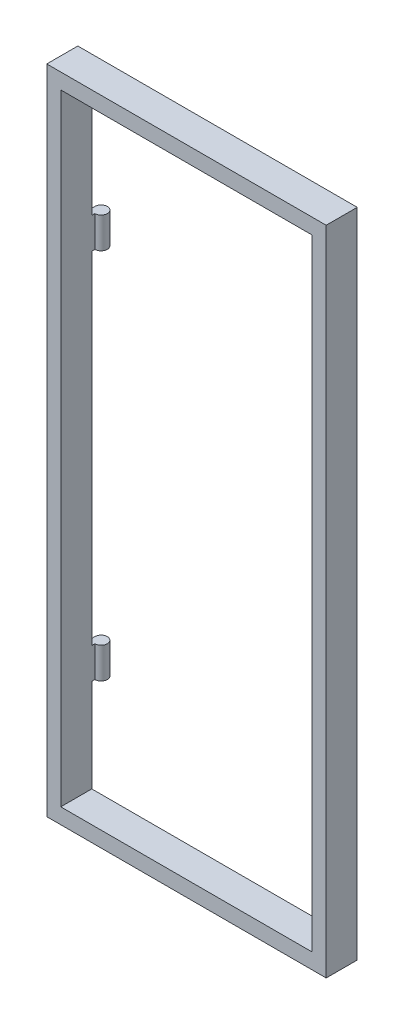
ISO-10303-21;
HEADER;
FILE_DESCRIPTION(('STEP AP214'),'2;1');
FILE_NAME('part.step','',(''),(''),'','','');
FILE_SCHEMA(('AUTOMOTIVE_DESIGN { 1 0 10303 214 1 1 1 1 }'));
ENDSEC;
DATA;
#1=APPLICATION_CONTEXT('core data for automotive mechanical design processes');
#2=APPLICATION_PROTOCOL_DEFINITION('international standard','automotive_design',2000,#1);
#3=PRODUCT_CONTEXT('',#1,'mechanical');
#4=PRODUCT('Part','Part','',(#3));
#5=PRODUCT_RELATED_PRODUCT_CATEGORY('part','',(#4));
#6=PRODUCT_DEFINITION_FORMATION('','',#4);
#7=PRODUCT_DEFINITION_CONTEXT('part definition',#1,'design');
#8=PRODUCT_DEFINITION('design','',#6,#7);
#9=PRODUCT_DEFINITION_SHAPE('','',#8);
#10=(LENGTH_UNIT() NAMED_UNIT(*) SI_UNIT(.MILLI.,.METRE.));
#11=(NAMED_UNIT(*) PLANE_ANGLE_UNIT() SI_UNIT($,.RADIAN.));
#12=(NAMED_UNIT(*) SI_UNIT($,.STERADIAN.) SOLID_ANGLE_UNIT());
#13=UNCERTAINTY_MEASURE_WITH_UNIT(LENGTH_MEASURE(1.E-05),#10,'distance_accuracy_value','');
#14=(GEOMETRIC_REPRESENTATION_CONTEXT(3) GLOBAL_UNCERTAINTY_ASSIGNED_CONTEXT((#13)) GLOBAL_UNIT_ASSIGNED_CONTEXT((#10,
#11,#12)) REPRESENTATION_CONTEXT('',''));
#15=CARTESIAN_POINT('',(0.,0.,0.));
#16=DIRECTION('',(0.,0.,1.));
#17=DIRECTION('',(1.,0.,0.));
#18=AXIS2_PLACEMENT_3D('',#15,#16,#17);
#19=CARTESIAN_POINT('',(-855.,2050.,-100.));
#20=DIRECTION('',(-1.,0.,0.));
#21=DIRECTION('',(0.,0.,-1.));
#22=AXIS2_PLACEMENT_3D('',#19,#20,#21);
#23=PLANE('',#22);
#24=DIRECTION('',(0.,1.,0.));
#25=VECTOR('',#24,1.);
#26=CARTESIAN_POINT('',(-855.,-706.568542494922,-110.000000000001));
#27=LINE('',#26,#25);
#28=CARTESIAN_POINT('',(-855.,350.000000000001,-110.000000000001));
#29=VERTEX_POINT('',#28);
#30=CARTESIAN_POINT('',(-855.,450.,-110.000000000001));
#31=VERTEX_POINT('',#30);
#32=EDGE_CURVE('E161',#29,#31,#27,.T.);
#33=ORIENTED_EDGE('',*,*,#32,.T.);
#34=DIRECTION('',(0.,0.,1.));
#35=VECTOR('',#34,1.);
#36=CARTESIAN_POINT('',(-855.,450.,-130.));
#37=LINE('',#36,#35);
#38=CARTESIAN_POINT('',(-855.,450.,-100.));
#39=VERTEX_POINT('',#38);
#40=EDGE_CURVE('E196',#31,#39,#37,.T.);
#41=ORIENTED_EDGE('',*,*,#40,.T.);
#42=DIRECTION('',(0.,1.,0.));
#43=VECTOR('',#42,1.);
#44=CARTESIAN_POINT('',(-855.,2050.,-100.));
#45=LINE('',#44,#43);
#46=CARTESIAN_POINT('',(-855.,1550.,-100.));
#47=VERTEX_POINT('',#46);
#48=EDGE_CURVE('E241',#39,#47,#45,.T.);
#49=ORIENTED_EDGE('',*,*,#48,.T.);
#50=DIRECTION('',(0.,0.,1.));
#51=VECTOR('',#50,1.);
#52=CARTESIAN_POINT('',(-855.,1550.,-130.));
#53=LINE('',#52,#51);
#54=CARTESIAN_POINT('',(-855.,1550.,-110.000000000001));
#55=VERTEX_POINT('',#54);
#56=EDGE_CURVE('E213',#55,#47,#53,.T.);
#57=ORIENTED_EDGE('',*,*,#56,.F.);
#58=DIRECTION('',(0.,1.,0.));
#59=VECTOR('',#58,1.);
#60=CARTESIAN_POINT('',(-855.,1493.43145750508,-110.000000000001));
#61=LINE('',#60,#59);
#62=CARTESIAN_POINT('',(-855.,1650.,-110.000000000001));
#63=VERTEX_POINT('',#62);
#64=EDGE_CURVE('E206',#55,#63,#61,.T.);
#65=ORIENTED_EDGE('',*,*,#64,.T.);
#66=DIRECTION('',(0.,0.,1.));
#67=VECTOR('',#66,1.);
#68=CARTESIAN_POINT('',(-855.,1650.,-130.));
#69=LINE('',#68,#67);
#70=CARTESIAN_POINT('',(-855.,1650.,-100.));
#71=VERTEX_POINT('',#70);
#72=EDGE_CURVE('E233',#63,#71,#69,.T.);
#73=ORIENTED_EDGE('',*,*,#72,.T.);
#74=CARTESIAN_POINT('',(-855.,2050.,-100.));
#75=VERTEX_POINT('',#74);
#76=EDGE_CURVE('E242',#71,#75,#45,.T.);
#77=ORIENTED_EDGE('',*,*,#76,.T.);
#78=DIRECTION('',(0.,0.,1.));
#79=VECTOR('',#78,1.);
#80=CARTESIAN_POINT('',(-855.,2050.,-100.));
#81=LINE('',#80,#79);
#82=CARTESIAN_POINT('',(-855.,2050.,0.));
#83=VERTEX_POINT('',#82);
#84=EDGE_CURVE('E253',#75,#83,#81,.T.);
#85=ORIENTED_EDGE('',*,*,#84,.T.);
#86=DIRECTION('',(0.,1.,0.));
#87=VECTOR('',#86,1.);
#88=CARTESIAN_POINT('',(-855.,2050.,0.));
#89=LINE('',#88,#87);
#90=CARTESIAN_POINT('',(-855.,49.9999999999998,0.));
#91=VERTEX_POINT('',#90);
#92=EDGE_CURVE('E237',#91,#83,#89,.T.);
#93=ORIENTED_EDGE('',*,*,#92,.F.);
#94=DIRECTION('',(0.,0.,1.));
#95=VECTOR('',#94,1.);
#96=CARTESIAN_POINT('',(-855.,49.9999999999998,-100.));
#97=LINE('',#96,#95);
#98=CARTESIAN_POINT('',(-855.,49.9999999999998,-100.));
#99=VERTEX_POINT('',#98);
#100=EDGE_CURVE('E268',#99,#91,#97,.T.);
#101=ORIENTED_EDGE('',*,*,#100,.F.);
#102=CARTESIAN_POINT('',(-855.,350.000000000001,-100.));
#103=VERTEX_POINT('',#102);
#104=EDGE_CURVE('E169',#99,#103,#45,.T.);
#105=ORIENTED_EDGE('',*,*,#104,.T.);
#106=DIRECTION('',(0.,0.,1.));
#107=VECTOR('',#106,1.);
#108=CARTESIAN_POINT('',(-855.,350.000000000001,-130.));
#109=LINE('',#108,#107);
#110=EDGE_CURVE('E156',#29,#103,#109,.T.);
#111=ORIENTED_EDGE('',*,*,#110,.F.);
#112=EDGE_LOOP('',(#33,#41,#49,#57,#65,#73,#77,#85,#93,#101,#105,#111));
#113=FACE_BOUND('',#112,.T.);
#114=ADVANCED_FACE('F36',(#113),#23,.F.);
#115=CARTESIAN_POINT('',(0.,0.,0.));
#116=DIRECTION('',(0.,0.,1.));
#117=DIRECTION('',(-1.,0.,0.));
#118=AXIS2_PLACEMENT_3D('',#115,#116,#117);
#119=PLANE('',#118);
#120=DIRECTION('',(0.,-1.,0.));
#121=VECTOR('',#120,1.);
#122=CARTESIAN_POINT('',(0.,2100.,0.));
#123=LINE('',#122,#121);
#124=CARTESIAN_POINT('',(0.,2100.,0.));
#125=VERTEX_POINT('',#124);
#126=CARTESIAN_POINT('',(0.,0.,0.));
#127=VERTEX_POINT('',#126);
#128=EDGE_CURVE('E272',#125,#127,#123,.T.);
#129=ORIENTED_EDGE('',*,*,#128,.F.);
#130=DIRECTION('',(1.,0.,0.));
#131=VECTOR('',#130,1.);
#132=CARTESIAN_POINT('',(0.,2100.,0.));
#133=LINE('',#132,#131);
#134=CARTESIAN_POINT('',(-900.,2100.,0.));
#135=VERTEX_POINT('',#134);
#136=EDGE_CURVE('E287',#135,#125,#133,.T.);
#137=ORIENTED_EDGE('',*,*,#136,.F.);
#138=DIRECTION('',(0.,1.,0.));
#139=VECTOR('',#138,1.);
#140=CARTESIAN_POINT('',(-900.,2100.,0.));
#141=LINE('',#140,#139);
#142=CARTESIAN_POINT('',(-900.,1.04083408558608E-13,0.));
#143=VERTEX_POINT('',#142);
#144=EDGE_CURVE('E303',#143,#135,#141,.T.);
#145=ORIENTED_EDGE('',*,*,#144,.F.);
#146=DIRECTION('',(-1.,0.,0.));
#147=VECTOR('',#146,1.);
#148=CARTESIAN_POINT('',(0.,0.,0.));
#149=LINE('',#148,#147);
#150=EDGE_CURVE('E299',#127,#143,#149,.T.);
#151=ORIENTED_EDGE('',*,*,#150,.F.);
#152=EDGE_LOOP('',(#129,#137,#145,#151));
#153=FACE_BOUND('',#152,.T.);
#154=DIRECTION('',(1.,0.,0.));
#155=VECTOR('',#154,1.);
#156=CARTESIAN_POINT('',(-855.,2050.,0.));
#157=LINE('',#156,#155);
#158=CARTESIAN_POINT('',(-44.9999999999999,2050.,0.));
#159=VERTEX_POINT('',#158);
#160=EDGE_CURVE('E257',#83,#159,#157,.T.);
#161=ORIENTED_EDGE('',*,*,#160,.T.);
#162=DIRECTION('',(0.,-1.,0.));
#163=VECTOR('',#162,1.);
#164=CARTESIAN_POINT('',(-44.9999999999999,2050.,0.));
#165=LINE('',#164,#163);
#166=CARTESIAN_POINT('',(-44.9999999999999,49.9999999999998,0.));
#167=VERTEX_POINT('',#166);
#168=EDGE_CURVE('E261',#159,#167,#165,.T.);
#169=ORIENTED_EDGE('',*,*,#168,.T.);
#170=DIRECTION('',(-1.,0.,0.));
#171=VECTOR('',#170,1.);
#172=CARTESIAN_POINT('',(-855.,49.9999999999998,0.));
#173=LINE('',#172,#171);
#174=EDGE_CURVE('E265',#167,#91,#173,.T.);
#175=ORIENTED_EDGE('',*,*,#174,.T.);
#176=ORIENTED_EDGE('',*,*,#92,.T.);
#177=EDGE_LOOP('',(#161,#169,#175,#176));
#178=FACE_BOUND('',#177,.T.);
#179=ADVANCED_FACE('F326',(#153,#178),#119,.T.);
#180=CARTESIAN_POINT('',(0.,2100.,-100.));
#181=DIRECTION('',(1.,0.,0.));
#182=DIRECTION('',(0.,-1.,0.));
#183=AXIS2_PLACEMENT_3D('',#180,#181,#182);
#184=PLANE('',#183);
#185=ORIENTED_EDGE('',*,*,#128,.T.);
#186=DIRECTION('',(0.,0.,1.));
#187=VECTOR('',#186,1.);
#188=CARTESIAN_POINT('',(0.,0.,-100.));
#189=LINE('',#188,#187);
#190=CARTESIAN_POINT('',(0.,0.,-100.));
#191=VERTEX_POINT('',#190);
#192=EDGE_CURVE('E40',#191,#127,#189,.T.);
#193=ORIENTED_EDGE('',*,*,#192,.F.);
#194=DIRECTION('',(0.,-1.,0.));
#195=VECTOR('',#194,1.);
#196=CARTESIAN_POINT('',(0.,2100.,-100.));
#197=LINE('',#196,#195);
#198=CARTESIAN_POINT('',(0.,2100.,-100.));
#199=VERTEX_POINT('',#198);
#200=EDGE_CURVE('E282',#199,#191,#197,.T.);
#201=ORIENTED_EDGE('',*,*,#200,.F.);
#202=DIRECTION('',(0.,0.,1.));
#203=VECTOR('',#202,1.);
#204=CARTESIAN_POINT('',(0.,2100.,-100.));
#205=LINE('',#204,#203);
#206=EDGE_CURVE('E11',#199,#125,#205,.T.);
#207=ORIENTED_EDGE('',*,*,#206,.T.);
#208=EDGE_LOOP('',(#185,#193,#201,#207));
#209=FACE_BOUND('',#208,.T.);
#210=ADVANCED_FACE('F38',(#209),#184,.T.);
#211=CARTESIAN_POINT('',(0.,2100.,-100.));
#212=DIRECTION('',(0.,1.,0.));
#213=DIRECTION('',(0.,0.,1.));
#214=AXIS2_PLACEMENT_3D('',#211,#212,#213);
#215=PLANE('',#214);
#216=ORIENTED_EDGE('',*,*,#136,.T.);
#217=ORIENTED_EDGE('',*,*,#206,.F.);
#218=DIRECTION('',(1.,0.,0.));
#219=VECTOR('',#218,1.);
#220=CARTESIAN_POINT('',(0.,2100.,-100.));
#221=LINE('',#220,#219);
#222=CARTESIAN_POINT('',(-900.,2100.,-100.));
#223=VERTEX_POINT('',#222);
#224=EDGE_CURVE('E293',#223,#199,#221,.T.);
#225=ORIENTED_EDGE('',*,*,#224,.F.);
#226=DIRECTION('',(0.,0.,1.));
#227=VECTOR('',#226,1.);
#228=CARTESIAN_POINT('',(-900.,2100.,-100.));
#229=LINE('',#228,#227);
#230=EDGE_CURVE('E46',#223,#135,#229,.T.);
#231=ORIENTED_EDGE('',*,*,#230,.T.);
#232=EDGE_LOOP('',(#216,#217,#225,#231));
#233=FACE_BOUND('',#232,.T.);
#234=ADVANCED_FACE('F332',(#233),#215,.T.);
#235=CARTESIAN_POINT('',(-900.,2100.,-100.));
#236=DIRECTION('',(-1.,0.,0.));
#237=DIRECTION('',(0.,0.,-1.));
#238=AXIS2_PLACEMENT_3D('',#235,#236,#237);
#239=PLANE('',#238);
#240=ORIENTED_EDGE('',*,*,#144,.T.);
#241=ORIENTED_EDGE('',*,*,#230,.F.);
#242=DIRECTION('',(0.,1.,0.));
#243=VECTOR('',#242,1.);
#244=CARTESIAN_POINT('',(-900.,2100.,-100.));
#245=LINE('',#244,#243);
#246=CARTESIAN_POINT('',(-900.,1.04083408558608E-13,-100.));
#247=VERTEX_POINT('',#246);
#248=EDGE_CURVE('E290',#247,#223,#245,.T.);
#249=ORIENTED_EDGE('',*,*,#248,.F.);
#250=DIRECTION('',(0.,0.,1.));
#251=VECTOR('',#250,1.);
#252=CARTESIAN_POINT('',(-900.,1.04083408558608E-13,-100.));
#253=LINE('',#252,#251);
#254=EDGE_CURVE('E311',#247,#143,#253,.T.);
#255=ORIENTED_EDGE('',*,*,#254,.T.);
#256=EDGE_LOOP('',(#240,#241,#249,#255));
#257=FACE_BOUND('',#256,.T.);
#258=ADVANCED_FACE('F334',(#257),#239,.T.);
#259=CARTESIAN_POINT('',(0.,0.,-100.));
#260=DIRECTION('',(0.,-1.,0.));
#261=DIRECTION('',(-1.,0.,0.));
#262=AXIS2_PLACEMENT_3D('',#259,#260,#261);
#263=PLANE('',#262);
#264=ORIENTED_EDGE('',*,*,#150,.T.);
#265=ORIENTED_EDGE('',*,*,#254,.F.);
#266=DIRECTION('',(-1.,0.,0.));
#267=VECTOR('',#266,1.);
#268=CARTESIAN_POINT('',(0.,0.,-100.));
#269=LINE('',#268,#267);
#270=EDGE_CURVE('E286',#191,#247,#269,.T.);
#271=ORIENTED_EDGE('',*,*,#270,.F.);
#272=ORIENTED_EDGE('',*,*,#192,.T.);
#273=EDGE_LOOP('',(#264,#265,#271,#272));
#274=FACE_BOUND('',#273,.T.);
#275=ADVANCED_FACE('F320',(#274),#263,.T.);
#276=CARTESIAN_POINT('',(0.,0.,-100.));
#277=DIRECTION('',(0.,0.,1.));
#278=DIRECTION('',(-1.,0.,0.));
#279=AXIS2_PLACEMENT_3D('',#276,#277,#278);
#280=PLANE('',#279);
#281=DIRECTION('',(0.,1.,0.));
#282=VECTOR('',#281,1.);
#283=CARTESIAN_POINT('',(-875.,450.,-100.));
#284=LINE('',#283,#282);
#285=CARTESIAN_POINT('',(-875.,350.000000000001,-100.));
#286=VERTEX_POINT('',#285);
#287=CARTESIAN_POINT('',(-875.,450.,-100.));
#288=VERTEX_POINT('',#287);
#289=EDGE_CURVE('E180',#286,#288,#284,.T.);
#290=ORIENTED_EDGE('',*,*,#289,.F.);
#291=DIRECTION('',(-1.,0.,0.));
#292=VECTOR('',#291,1.);
#293=CARTESIAN_POINT('',(-855.,350.000000000001,-100.));
#294=LINE('',#293,#292);
#295=EDGE_CURVE('E185',#103,#286,#294,.T.);
#296=ORIENTED_EDGE('',*,*,#295,.F.);
#297=ORIENTED_EDGE('',*,*,#104,.F.);
#298=DIRECTION('',(-1.,0.,0.));
#299=VECTOR('',#298,1.);
#300=CARTESIAN_POINT('',(-855.,49.9999999999998,-100.));
#301=LINE('',#300,#299);
#302=CARTESIAN_POINT('',(-44.9999999999999,49.9999999999998,-100.));
#303=VERTEX_POINT('',#302);
#304=EDGE_CURVE('E250',#303,#99,#301,.T.);
#305=ORIENTED_EDGE('',*,*,#304,.F.);
#306=DIRECTION('',(0.,-1.,0.));
#307=VECTOR('',#306,1.);
#308=CARTESIAN_POINT('',(-44.9999999999999,2050.,-100.));
#309=LINE('',#308,#307);
#310=CARTESIAN_POINT('',(-44.9999999999999,2050.,-100.));
#311=VERTEX_POINT('',#310);
#312=EDGE_CURVE('E246',#311,#303,#309,.T.);
#313=ORIENTED_EDGE('',*,*,#312,.F.);
#314=DIRECTION('',(1.,0.,0.));
#315=VECTOR('',#314,1.);
#316=CARTESIAN_POINT('',(-855.,2050.,-100.));
#317=LINE('',#316,#315);
#318=EDGE_CURVE('E240',#75,#311,#317,.T.);
#319=ORIENTED_EDGE('',*,*,#318,.F.);
#320=ORIENTED_EDGE('',*,*,#76,.F.);
#321=DIRECTION('',(1.,0.,0.));
#322=VECTOR('',#321,1.);
#323=CARTESIAN_POINT('',(-855.,1650.,-100.));
#324=LINE('',#323,#322);
#325=CARTESIAN_POINT('',(-875.,1650.,-100.));
#326=VERTEX_POINT('',#325);
#327=EDGE_CURVE('E62',#326,#71,#324,.T.);
#328=ORIENTED_EDGE('',*,*,#327,.F.);
#329=DIRECTION('',(0.,1.,0.));
#330=VECTOR('',#329,1.);
#331=CARTESIAN_POINT('',(-875.,1650.,-100.));
#332=LINE('',#331,#330);
#333=CARTESIAN_POINT('',(-875.,1550.,-100.));
#334=VERTEX_POINT('',#333);
#335=EDGE_CURVE('E217',#334,#326,#332,.T.);
#336=ORIENTED_EDGE('',*,*,#335,.F.);
#337=DIRECTION('',(-1.,0.,0.));
#338=VECTOR('',#337,1.);
#339=CARTESIAN_POINT('',(-855.,1550.,-100.));
#340=LINE('',#339,#338);
#341=EDGE_CURVE('E214',#47,#334,#340,.T.);
#342=ORIENTED_EDGE('',*,*,#341,.F.);
#343=ORIENTED_EDGE('',*,*,#48,.F.);
#344=DIRECTION('',(1.,0.,0.));
#345=VECTOR('',#344,1.);
#346=CARTESIAN_POINT('',(-855.,450.,-100.));
#347=LINE('',#346,#345);
#348=EDGE_CURVE('E177',#288,#39,#347,.T.);
#349=ORIENTED_EDGE('',*,*,#348,.F.);
#350=EDGE_LOOP('',(#290,#296,#297,#305,#313,#319,#320,#328,#336,#342,#343,#349));
#351=FACE_BOUND('',#350,.T.);
#352=ORIENTED_EDGE('',*,*,#200,.T.);
#353=ORIENTED_EDGE('',*,*,#270,.T.);
#354=ORIENTED_EDGE('',*,*,#248,.T.);
#355=ORIENTED_EDGE('',*,*,#224,.T.);
#356=EDGE_LOOP('',(#352,#353,#354,#355));
#357=FACE_BOUND('',#356,.T.);
#358=ADVANCED_FACE('F341',(#351,#357),#280,.F.);
#359=CARTESIAN_POINT('',(-855.,49.9999999999998,-100.));
#360=DIRECTION('',(0.,-1.,0.));
#361=DIRECTION('',(0.,0.,-1.));
#362=AXIS2_PLACEMENT_3D('',#359,#360,#361);
#363=PLANE('',#362);
#364=ORIENTED_EDGE('',*,*,#174,.F.);
#365=DIRECTION('',(0.,0.,1.));
#366=VECTOR('',#365,1.);
#367=CARTESIAN_POINT('',(-44.9999999999999,49.9999999999998,-100.));
#368=LINE('',#367,#366);
#369=EDGE_CURVE('E273',#303,#167,#368,.T.);
#370=ORIENTED_EDGE('',*,*,#369,.F.);
#371=ORIENTED_EDGE('',*,*,#304,.T.);
#372=ORIENTED_EDGE('',*,*,#100,.T.);
#373=EDGE_LOOP('',(#364,#370,#371,#372));
#374=FACE_BOUND('',#373,.T.);
#375=ADVANCED_FACE('F354',(#374),#363,.F.);
#376=CARTESIAN_POINT('',(-44.9999999999999,2050.,-100.));
#377=DIRECTION('',(1.,0.,0.));
#378=DIRECTION('',(0.,0.,1.));
#379=AXIS2_PLACEMENT_3D('',#376,#377,#378);
#380=PLANE('',#379);
#381=ORIENTED_EDGE('',*,*,#168,.F.);
#382=DIRECTION('',(0.,0.,1.));
#383=VECTOR('',#382,1.);
#384=CARTESIAN_POINT('',(-44.9999999999999,2050.,-100.));
#385=LINE('',#384,#383);
#386=EDGE_CURVE('E276',#311,#159,#385,.T.);
#387=ORIENTED_EDGE('',*,*,#386,.F.);
#388=ORIENTED_EDGE('',*,*,#312,.T.);
#389=ORIENTED_EDGE('',*,*,#369,.T.);
#390=EDGE_LOOP('',(#381,#387,#388,#389));
#391=FACE_BOUND('',#390,.T.);
#392=ADVANCED_FACE('F359',(#391),#380,.F.);
#393=CARTESIAN_POINT('',(-855.,2050.,-100.));
#394=DIRECTION('',(0.,1.,0.));
#395=DIRECTION('',(0.,0.,1.));
#396=AXIS2_PLACEMENT_3D('',#393,#394,#395);
#397=PLANE('',#396);
#398=ORIENTED_EDGE('',*,*,#160,.F.);
#399=ORIENTED_EDGE('',*,*,#84,.F.);
#400=ORIENTED_EDGE('',*,*,#318,.T.);
#401=ORIENTED_EDGE('',*,*,#386,.T.);
#402=EDGE_LOOP('',(#398,#399,#400,#401));
#403=FACE_BOUND('',#402,.T.);
#404=ADVANCED_FACE('F351',(#403),#397,.F.);
#405=CARTESIAN_POINT('',(-855.,1650.,-130.));
#406=DIRECTION('',(0.,1.,0.));
#407=DIRECTION('',(0.,0.,1.));
#408=AXIS2_PLACEMENT_3D('',#405,#406,#407);
#409=PLANE('',#408);
#410=CARTESIAN_POINT('',(-855.,1650.,-130.));
#411=DIRECTION('',(0.,1.,0.));
#412=DIRECTION('',(0.,0.,-1.));
#413=AXIS2_PLACEMENT_3D('',#410,#411,#412);
#414=CIRCLE('',#413,19.9999999999993);
#415=CARTESIAN_POINT('',(-875.,1650.,-130.));
#416=VERTEX_POINT('',#415);
#417=EDGE_CURVE('E199',#63,#416,#414,.T.);
#418=ORIENTED_EDGE('',*,*,#417,.T.);
#419=DIRECTION('',(0.,0.,1.));
#420=VECTOR('',#419,1.);
#421=CARTESIAN_POINT('',(-875.,1650.,-130.));
#422=LINE('',#421,#420);
#423=EDGE_CURVE('E230',#416,#326,#422,.T.);
#424=ORIENTED_EDGE('',*,*,#423,.T.);
#425=ORIENTED_EDGE('',*,*,#327,.T.);
#426=ORIENTED_EDGE('',*,*,#72,.F.);
#427=EDGE_LOOP('',(#418,#424,#425,#426));
#428=FACE_BOUND('',#427,.T.);
#429=ADVANCED_FACE('F389',(#428),#409,.T.);
#430=CARTESIAN_POINT('',(-875.,1650.,-130.));
#431=DIRECTION('',(-1.,0.,0.));
#432=DIRECTION('',(0.,0.,-1.));
#433=AXIS2_PLACEMENT_3D('',#430,#431,#432);
#434=PLANE('',#433);
#435=ORIENTED_EDGE('',*,*,#335,.T.);
#436=ORIENTED_EDGE('',*,*,#423,.F.);
#437=DIRECTION('',(0.,1.,0.));
#438=VECTOR('',#437,1.);
#439=CARTESIAN_POINT('',(-875.,1650.,-130.));
#440=LINE('',#439,#438);
#441=CARTESIAN_POINT('',(-875.,1550.,-130.));
#442=VERTEX_POINT('',#441);
#443=EDGE_CURVE('E210',#442,#416,#440,.T.);
#444=ORIENTED_EDGE('',*,*,#443,.F.);
#445=DIRECTION('',(0.,0.,1.));
#446=VECTOR('',#445,1.);
#447=CARTESIAN_POINT('',(-875.,1550.,-130.));
#448=LINE('',#447,#446);
#449=EDGE_CURVE('E227',#442,#334,#448,.T.);
#450=ORIENTED_EDGE('',*,*,#449,.T.);
#451=EDGE_LOOP('',(#435,#436,#444,#450));
#452=FACE_BOUND('',#451,.T.);
#453=ADVANCED_FACE('F393',(#452),#434,.T.);
#454=CARTESIAN_POINT('',(-855.,1550.,-130.));
#455=DIRECTION('',(0.,-1.,0.));
#456=DIRECTION('',(0.,0.,-1.));
#457=AXIS2_PLACEMENT_3D('',#454,#455,#456);
#458=PLANE('',#457);
#459=ORIENTED_EDGE('',*,*,#56,.T.);
#460=ORIENTED_EDGE('',*,*,#341,.T.);
#461=ORIENTED_EDGE('',*,*,#449,.F.);
#462=CARTESIAN_POINT('',(-855.,1550.,-130.));
#463=DIRECTION('',(0.,-1.,0.));
#464=DIRECTION('',(0.,0.,1.));
#465=AXIS2_PLACEMENT_3D('',#462,#463,#464);
#466=CIRCLE('',#465,19.9999999999993);
#467=EDGE_CURVE('E203',#442,#55,#466,.T.);
#468=ORIENTED_EDGE('',*,*,#467,.T.);
#469=EDGE_LOOP('',(#459,#460,#461,#468));
#470=FACE_BOUND('',#469,.T.);
#471=ADVANCED_FACE('F396',(#470),#458,.T.);
#472=CARTESIAN_POINT('',(-855.,1493.43145750508,-130.));
#473=DIRECTION('',(0.,1.,0.));
#474=DIRECTION('',(0.,0.,1.));
#475=AXIS2_PLACEMENT_3D('',#472,#473,#474);
#476=CYLINDRICAL_SURFACE('',#475,19.9999999999993);
#477=ORIENTED_EDGE('',*,*,#467,.F.);
#478=ORIENTED_EDGE('',*,*,#443,.T.);
#479=ORIENTED_EDGE('',*,*,#417,.F.);
#480=ORIENTED_EDGE('',*,*,#64,.F.);
#481=EDGE_LOOP('',(#477,#478,#479,#480));
#482=FACE_BOUND('',#481,.T.);
#483=ADVANCED_FACE('F400',(#482),#476,.T.);
#484=CARTESIAN_POINT('',(-855.,450.,-130.));
#485=DIRECTION('',(0.,1.,0.));
#486=DIRECTION('',(0.,0.,1.));
#487=AXIS2_PLACEMENT_3D('',#484,#485,#486);
#488=PLANE('',#487);
#489=CARTESIAN_POINT('',(-855.,450.,-130.));
#490=DIRECTION('',(0.,1.,0.));
#491=DIRECTION('',(0.,0.,-1.));
#492=AXIS2_PLACEMENT_3D('',#489,#490,#491);
#493=CIRCLE('',#492,19.9999999999993);
#494=CARTESIAN_POINT('',(-875.,450.,-130.));
#495=VERTEX_POINT('',#494);
#496=EDGE_CURVE('E162',#31,#495,#493,.T.);
#497=ORIENTED_EDGE('',*,*,#496,.T.);
#498=DIRECTION('',(0.,0.,1.));
#499=VECTOR('',#498,1.);
#500=CARTESIAN_POINT('',(-875.,450.,-130.));
#501=LINE('',#500,#499);
#502=EDGE_CURVE('E193',#495,#288,#501,.T.);
#503=ORIENTED_EDGE('',*,*,#502,.T.);
#504=ORIENTED_EDGE('',*,*,#348,.T.);
#505=ORIENTED_EDGE('',*,*,#40,.F.);
#506=EDGE_LOOP('',(#497,#503,#504,#505));
#507=FACE_BOUND('',#506,.T.);
#508=ADVANCED_FACE('F369',(#507),#488,.T.);
#509=CARTESIAN_POINT('',(-875.,450.,-130.));
#510=DIRECTION('',(-1.,0.,0.));
#511=DIRECTION('',(0.,0.,-1.));
#512=AXIS2_PLACEMENT_3D('',#509,#510,#511);
#513=PLANE('',#512);
#514=ORIENTED_EDGE('',*,*,#289,.T.);
#515=ORIENTED_EDGE('',*,*,#502,.F.);
#516=DIRECTION('',(0.,1.,0.));
#517=VECTOR('',#516,1.);
#518=CARTESIAN_POINT('',(-875.,450.,-130.));
#519=LINE('',#518,#517);
#520=CARTESIAN_POINT('',(-875.,350.000000000001,-130.));
#521=VERTEX_POINT('',#520);
#522=EDGE_CURVE('E171',#521,#495,#519,.T.);
#523=ORIENTED_EDGE('',*,*,#522,.F.);
#524=DIRECTION('',(0.,0.,1.));
#525=VECTOR('',#524,1.);
#526=CARTESIAN_POINT('',(-875.,350.000000000001,-130.));
#527=LINE('',#526,#525);
#528=EDGE_CURVE('E54',#521,#286,#527,.T.);
#529=ORIENTED_EDGE('',*,*,#528,.T.);
#530=EDGE_LOOP('',(#514,#515,#523,#529));
#531=FACE_BOUND('',#530,.T.);
#532=ADVANCED_FACE('F367',(#531),#513,.T.);
#533=CARTESIAN_POINT('',(-855.,350.000000000001,-130.));
#534=DIRECTION('',(0.,-1.,0.));
#535=DIRECTION('',(0.,0.,-1.));
#536=AXIS2_PLACEMENT_3D('',#533,#534,#535);
#537=PLANE('',#536);
#538=ORIENTED_EDGE('',*,*,#110,.T.);
#539=ORIENTED_EDGE('',*,*,#295,.T.);
#540=ORIENTED_EDGE('',*,*,#528,.F.);
#541=CARTESIAN_POINT('',(-855.,350.000000000001,-130.));
#542=DIRECTION('',(0.,-1.,0.));
#543=DIRECTION('',(0.,0.,1.));
#544=AXIS2_PLACEMENT_3D('',#541,#542,#543);
#545=CIRCLE('',#544,19.9999999999993);
#546=EDGE_CURVE('E153',#521,#29,#545,.T.);
#547=ORIENTED_EDGE('',*,*,#546,.T.);
#548=EDGE_LOOP('',(#538,#539,#540,#547));
#549=FACE_BOUND('',#548,.T.);
#550=ADVANCED_FACE('F155',(#549),#537,.T.);
#551=CARTESIAN_POINT('',(-855.,-706.568542494922,-130.));
#552=DIRECTION('',(0.,1.,0.));
#553=DIRECTION('',(0.,0.,1.));
#554=AXIS2_PLACEMENT_3D('',#551,#552,#553);
#555=CYLINDRICAL_SURFACE('',#554,19.9999999999993);
#556=ORIENTED_EDGE('',*,*,#546,.F.);
#557=ORIENTED_EDGE('',*,*,#522,.T.);
#558=ORIENTED_EDGE('',*,*,#496,.F.);
#559=ORIENTED_EDGE('',*,*,#32,.F.);
#560=EDGE_LOOP('',(#556,#557,#558,#559));
#561=FACE_BOUND('',#560,.T.);
#562=ADVANCED_FACE('F173',(#561),#555,.T.);
#563=CLOSED_SHELL('',(#114,#179,#210,#234,#258,#275,#358,#375,#392,#404,#429,#453,#471,#483,
#508,#532,#550,#562));
#564=MANIFOLD_SOLID_BREP('B2',#563);
#565=ADVANCED_BREP_SHAPE_REPRESENTATION('',(#18,#564),#14);
#566=SHAPE_DEFINITION_REPRESENTATION(#9,#565);
ENDSEC;
END-ISO-10303-21;
